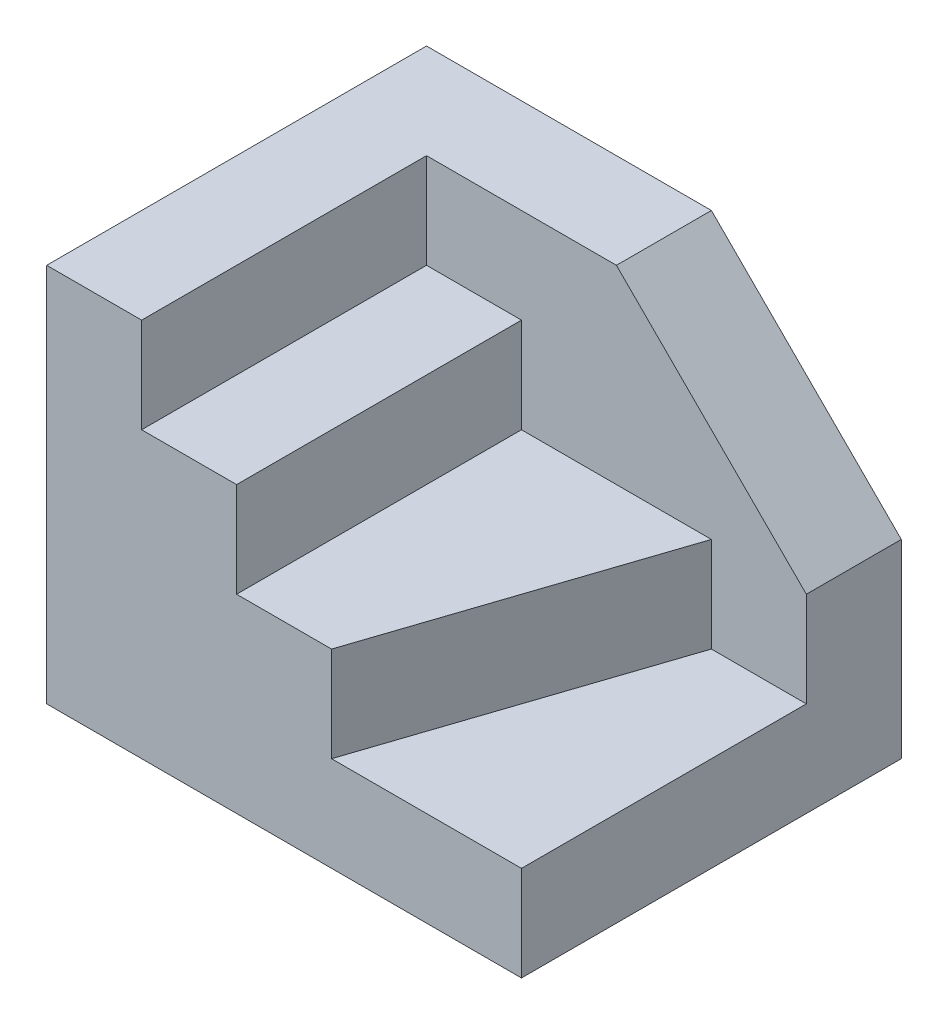
ISO-10303-21;
HEADER;
FILE_DESCRIPTION(('STEP AP214'),'2;1');
FILE_NAME('part.step','',(''),(''),'','','');
FILE_SCHEMA(('AUTOMOTIVE_DESIGN { 1 0 10303 214 1 1 1 1 }'));
ENDSEC;
DATA;
#1=APPLICATION_CONTEXT('core data for automotive mechanical design processes');
#2=APPLICATION_PROTOCOL_DEFINITION('international standard','automotive_design',2000,#1);
#3=PRODUCT_CONTEXT('',#1,'mechanical');
#4=PRODUCT('Part','Part','',(#3));
#5=PRODUCT_RELATED_PRODUCT_CATEGORY('part','',(#4));
#6=PRODUCT_DEFINITION_FORMATION('','',#4);
#7=PRODUCT_DEFINITION_CONTEXT('part definition',#1,'design');
#8=PRODUCT_DEFINITION('design','',#6,#7);
#9=PRODUCT_DEFINITION_SHAPE('','',#8);
#10=(LENGTH_UNIT() NAMED_UNIT(*) SI_UNIT(.MILLI.,.METRE.));
#11=(NAMED_UNIT(*) PLANE_ANGLE_UNIT() SI_UNIT($,.RADIAN.));
#12=(NAMED_UNIT(*) SI_UNIT($,.STERADIAN.) SOLID_ANGLE_UNIT());
#13=UNCERTAINTY_MEASURE_WITH_UNIT(LENGTH_MEASURE(1.E-05),#10,'distance_accuracy_value','');
#14=(GEOMETRIC_REPRESENTATION_CONTEXT(3) GLOBAL_UNCERTAINTY_ASSIGNED_CONTEXT((#13)) GLOBAL_UNIT_ASSIGNED_CONTEXT((#10,
#11,#12)) REPRESENTATION_CONTEXT('',''));
#15=CARTESIAN_POINT('',(0.,0.,0.));
#16=DIRECTION('',(0.,0.,1.));
#17=DIRECTION('',(1.,0.,0.));
#18=AXIS2_PLACEMENT_3D('',#15,#16,#17);
#19=CARTESIAN_POINT('',(-10.,26.4814814814815,30.));
#20=DIRECTION('',(0.,-1.,0.));
#21=DIRECTION('',(0.,0.,-1.));
#22=AXIS2_PLACEMENT_3D('',#19,#20,#21);
#23=PLANE('',#22);
#24=DIRECTION('',(0.,0.,-1.));
#25=VECTOR('',#24,1.);
#26=CARTESIAN_POINT('',(-10.,26.4814814814815,30.));
#27=LINE('',#26,#25);
#28=CARTESIAN_POINT('',(-10.,26.4814814814815,30.));
#29=VERTEX_POINT('',#28);
#30=CARTESIAN_POINT('',(-10.,26.4814814814815,0.));
#31=VERTEX_POINT('',#30);
#32=EDGE_CURVE('E196',#29,#31,#27,.T.);
#33=ORIENTED_EDGE('',*,*,#32,.T.);
#34=DIRECTION('',(1.,0.,0.));
#35=VECTOR('',#34,1.);
#36=CARTESIAN_POINT('',(-20.,26.4814814814815,0.));
#37=LINE('',#36,#35);
#38=CARTESIAN_POINT('',(10.,26.4814814814815,0.));
#39=VERTEX_POINT('',#38);
#40=EDGE_CURVE('E149',#31,#39,#37,.T.);
#41=ORIENTED_EDGE('',*,*,#40,.T.);
#42=DIRECTION('',(0.,0.,1.));
#43=VECTOR('',#42,1.);
#44=CARTESIAN_POINT('',(10.,26.4814814814815,-10.));
#45=LINE('',#44,#43);
#46=CARTESIAN_POINT('',(10.,26.4814814814815,-10.));
#47=VERTEX_POINT('',#46);
#48=EDGE_CURVE('E127',#47,#39,#45,.T.);
#49=ORIENTED_EDGE('',*,*,#48,.F.);
#50=DIRECTION('',(1.,0.,0.));
#51=VECTOR('',#50,1.);
#52=CARTESIAN_POINT('',(-20.,26.4814814814815,-10.));
#53=LINE('',#52,#51);
#54=CARTESIAN_POINT('',(-20.,26.4814814814815,-10.));
#55=VERTEX_POINT('',#54);
#56=EDGE_CURVE('E135',#55,#47,#53,.T.);
#57=ORIENTED_EDGE('',*,*,#56,.F.);
#58=DIRECTION('',(0.,0.,-1.));
#59=VECTOR('',#58,1.);
#60=CARTESIAN_POINT('',(-20.,26.4814814814815,30.));
#61=LINE('',#60,#59);
#62=CARTESIAN_POINT('',(-20.,26.4814814814815,30.));
#63=VERTEX_POINT('',#62);
#64=EDGE_CURVE('E11',#63,#55,#61,.T.);
#65=ORIENTED_EDGE('',*,*,#64,.F.);
#66=DIRECTION('',(-1.,0.,0.));
#67=VECTOR('',#66,1.);
#68=CARTESIAN_POINT('',(-10.,26.4814814814815,30.));
#69=LINE('',#68,#67);
#70=EDGE_CURVE('E169',#29,#63,#69,.T.);
#71=ORIENTED_EDGE('',*,*,#70,.F.);
#72=EDGE_LOOP('',(#33,#41,#49,#57,#65,#71));
#73=FACE_BOUND('',#72,.T.);
#74=ADVANCED_FACE('F39',(#73),#23,.F.);
#75=CARTESIAN_POINT('',(-20.,26.4814814814815,30.));
#76=DIRECTION('',(1.,0.,0.));
#77=DIRECTION('',(0.,1.,0.));
#78=AXIS2_PLACEMENT_3D('',#75,#76,#77);
#79=PLANE('',#78);
#80=ORIENTED_EDGE('',*,*,#64,.T.);
#81=DIRECTION('',(0.,1.,0.));
#82=VECTOR('',#81,1.);
#83=CARTESIAN_POINT('',(-20.,26.4814814814815,-10.));
#84=LINE('',#83,#82);
#85=CARTESIAN_POINT('',(-20.,-13.5185185185185,-10.));
#86=VERTEX_POINT('',#85);
#87=EDGE_CURVE('E142',#86,#55,#84,.T.);
#88=ORIENTED_EDGE('',*,*,#87,.F.);
#89=DIRECTION('',(0.,0.,-1.));
#90=VECTOR('',#89,1.);
#91=CARTESIAN_POINT('',(-20.,-13.5185185185185,30.));
#92=LINE('',#91,#90);
#93=CARTESIAN_POINT('',(-20.,-13.5185185185185,30.));
#94=VERTEX_POINT('',#93);
#95=EDGE_CURVE('E48',#94,#86,#92,.T.);
#96=ORIENTED_EDGE('',*,*,#95,.F.);
#97=DIRECTION('',(0.,-1.,0.));
#98=VECTOR('',#97,1.);
#99=CARTESIAN_POINT('',(-20.,26.4814814814815,30.));
#100=LINE('',#99,#98);
#101=EDGE_CURVE('E172',#63,#94,#100,.T.);
#102=ORIENTED_EDGE('',*,*,#101,.F.);
#103=EDGE_LOOP('',(#80,#88,#96,#102));
#104=FACE_BOUND('',#103,.T.);
#105=ADVANCED_FACE('F250',(#104),#79,.F.);
#106=CARTESIAN_POINT('',(-20.,-13.5185185185185,30.));
#107=DIRECTION('',(0.,1.,0.));
#108=DIRECTION('',(-1.,0.,0.));
#109=AXIS2_PLACEMENT_3D('',#106,#107,#108);
#110=PLANE('',#109);
#111=ORIENTED_EDGE('',*,*,#95,.T.);
#112=DIRECTION('',(-1.,0.,0.));
#113=VECTOR('',#112,1.);
#114=CARTESIAN_POINT('',(-20.,-13.5185185185185,-10.));
#115=LINE('',#114,#113);
#116=CARTESIAN_POINT('',(30.,-13.5185185185185,-10.));
#117=VERTEX_POINT('',#116);
#118=EDGE_CURVE('E246',#117,#86,#115,.T.);
#119=ORIENTED_EDGE('',*,*,#118,.F.);
#120=DIRECTION('',(0.,0.,-1.));
#121=VECTOR('',#120,1.);
#122=CARTESIAN_POINT('',(30.,-13.5185185185185,30.));
#123=LINE('',#122,#121);
#124=CARTESIAN_POINT('',(30.,-13.5185185185185,30.));
#125=VERTEX_POINT('',#124);
#126=EDGE_CURVE('E237',#125,#117,#123,.T.);
#127=ORIENTED_EDGE('',*,*,#126,.F.);
#128=DIRECTION('',(1.,0.,0.));
#129=VECTOR('',#128,1.);
#130=CARTESIAN_POINT('',(-20.,-13.5185185185185,30.));
#131=LINE('',#130,#129);
#132=EDGE_CURVE('E176',#94,#125,#131,.T.);
#133=ORIENTED_EDGE('',*,*,#132,.F.);
#134=EDGE_LOOP('',(#111,#119,#127,#133));
#135=FACE_BOUND('',#134,.T.);
#136=ADVANCED_FACE('F244',(#135),#110,.F.);
#137=CARTESIAN_POINT('',(30.,-13.5185185185185,30.));
#138=DIRECTION('',(-1.,0.,0.));
#139=DIRECTION('',(0.,-1.,0.));
#140=AXIS2_PLACEMENT_3D('',#137,#138,#139);
#141=PLANE('',#140);
#142=ORIENTED_EDGE('',*,*,#126,.T.);
#143=DIRECTION('',(0.,-1.,0.));
#144=VECTOR('',#143,1.);
#145=CARTESIAN_POINT('',(30.,-13.5185185185185,-10.));
#146=LINE('',#145,#144);
#147=CARTESIAN_POINT('',(30.,6.48148148148147,-10.));
#148=VERTEX_POINT('',#147);
#149=EDGE_CURVE('E134',#148,#117,#146,.T.);
#150=ORIENTED_EDGE('',*,*,#149,.F.);
#151=DIRECTION('',(0.,0.,1.));
#152=VECTOR('',#151,1.);
#153=CARTESIAN_POINT('',(30.,6.48148148148147,-10.));
#154=LINE('',#153,#152);
#155=CARTESIAN_POINT('',(30.,6.48148148148147,0.));
#156=VERTEX_POINT('',#155);
#157=EDGE_CURVE('E129',#148,#156,#154,.T.);
#158=ORIENTED_EDGE('',*,*,#157,.T.);
#159=DIRECTION('',(0.,-1.,0.));
#160=VECTOR('',#159,1.);
#161=CARTESIAN_POINT('',(30.,-13.5185185185185,0.));
#162=LINE('',#161,#160);
#163=CARTESIAN_POINT('',(30.,-3.51851851851852,0.));
#164=VERTEX_POINT('',#163);
#165=EDGE_CURVE('E146',#156,#164,#162,.T.);
#166=ORIENTED_EDGE('',*,*,#165,.T.);
#167=DIRECTION('',(0.,0.,-1.));
#168=VECTOR('',#167,1.);
#169=CARTESIAN_POINT('',(30.,-3.51851851851852,30.));
#170=LINE('',#169,#168);
#171=CARTESIAN_POINT('',(30.,-3.51851851851852,30.));
#172=VERTEX_POINT('',#171);
#173=EDGE_CURVE('E233',#172,#164,#170,.T.);
#174=ORIENTED_EDGE('',*,*,#173,.F.);
#175=DIRECTION('',(0.,1.,0.));
#176=VECTOR('',#175,1.);
#177=CARTESIAN_POINT('',(30.,-13.5185185185185,30.));
#178=LINE('',#177,#176);
#179=EDGE_CURVE('E179',#125,#172,#178,.T.);
#180=ORIENTED_EDGE('',*,*,#179,.F.);
#181=EDGE_LOOP('',(#142,#150,#158,#166,#174,#180));
#182=FACE_BOUND('',#181,.T.);
#183=ADVANCED_FACE('F264',(#182),#141,.F.);
#184=CARTESIAN_POINT('',(30.,-3.51851851851852,30.));
#185=DIRECTION('',(0.,-1.,0.));
#186=DIRECTION('',(1.,0.,0.));
#187=AXIS2_PLACEMENT_3D('',#184,#185,#186);
#188=PLANE('',#187);
#189=DIRECTION('',(-1.,0.,0.));
#190=VECTOR('',#189,1.);
#191=CARTESIAN_POINT('',(30.,-3.51851851851852,0.));
#192=LINE('',#191,#190);
#193=CARTESIAN_POINT('',(20.,-3.51851851851853,0.));
#194=VERTEX_POINT('',#193);
#195=EDGE_CURVE('E168',#164,#194,#192,.T.);
#196=ORIENTED_EDGE('',*,*,#195,.T.);
#197=DIRECTION('',(-0.316227766016838,0.,0.948683298050514));
#198=VECTOR('',#197,1.);
#199=CARTESIAN_POINT('',(20.,-3.51851851851853,0.));
#200=LINE('',#199,#198);
#201=CARTESIAN_POINT('',(10.,-3.51851851851853,30.));
#202=VERTEX_POINT('',#201);
#203=EDGE_CURVE('E156',#194,#202,#200,.T.);
#204=ORIENTED_EDGE('',*,*,#203,.T.);
#205=DIRECTION('',(-1.,0.,0.));
#206=VECTOR('',#205,1.);
#207=CARTESIAN_POINT('',(30.,-3.51851851851852,30.));
#208=LINE('',#207,#206);
#209=EDGE_CURVE('E182',#172,#202,#208,.T.);
#210=ORIENTED_EDGE('',*,*,#209,.F.);
#211=ORIENTED_EDGE('',*,*,#173,.T.);
#212=EDGE_LOOP('',(#196,#204,#210,#211));
#213=FACE_BOUND('',#212,.T.);
#214=ADVANCED_FACE('F269',(#213),#188,.F.);
#215=CARTESIAN_POINT('',(20.,6.48148148148147,30.));
#216=DIRECTION('',(0.,-1.,0.));
#217=DIRECTION('',(1.,0.,0.));
#218=AXIS2_PLACEMENT_3D('',#215,#216,#217);
#219=PLANE('',#218);
#220=DIRECTION('',(-1.,0.,0.));
#221=VECTOR('',#220,1.);
#222=CARTESIAN_POINT('',(20.,6.48148148148147,30.));
#223=LINE('',#222,#221);
#224=CARTESIAN_POINT('',(10.,6.48148148148147,30.));
#225=VERTEX_POINT('',#224);
#226=CARTESIAN_POINT('',(0.,6.48148148148147,30.));
#227=VERTEX_POINT('',#226);
#228=EDGE_CURVE('E185',#225,#227,#223,.T.);
#229=ORIENTED_EDGE('',*,*,#228,.F.);
#230=DIRECTION('',(-0.316227766016838,0.,0.948683298050514));
#231=VECTOR('',#230,1.);
#232=CARTESIAN_POINT('',(20.,6.48148148148147,0.));
#233=LINE('',#232,#231);
#234=CARTESIAN_POINT('',(20.,6.48148148148147,0.));
#235=VERTEX_POINT('',#234);
#236=EDGE_CURVE('E152',#235,#225,#233,.T.);
#237=ORIENTED_EDGE('',*,*,#236,.F.);
#238=DIRECTION('',(-1.,0.,0.));
#239=VECTOR('',#238,1.);
#240=CARTESIAN_POINT('',(20.,6.48148148148147,0.));
#241=LINE('',#240,#239);
#242=CARTESIAN_POINT('',(0.,6.48148148148147,0.));
#243=VERTEX_POINT('',#242);
#244=EDGE_CURVE('E204',#235,#243,#241,.T.);
#245=ORIENTED_EDGE('',*,*,#244,.T.);
#246=DIRECTION('',(0.,0.,-1.));
#247=VECTOR('',#246,1.);
#248=CARTESIAN_POINT('',(0.,6.48148148148147,30.));
#249=LINE('',#248,#247);
#250=EDGE_CURVE('E229',#227,#243,#249,.T.);
#251=ORIENTED_EDGE('',*,*,#250,.F.);
#252=EDGE_LOOP('',(#229,#237,#245,#251));
#253=FACE_BOUND('',#252,.T.);
#254=ADVANCED_FACE('F279',(#253),#219,.F.);
#255=CARTESIAN_POINT('',(0.,6.48148148148147,30.));
#256=DIRECTION('',(-1.,0.,0.));
#257=DIRECTION('',(0.,-1.,0.));
#258=AXIS2_PLACEMENT_3D('',#255,#256,#257);
#259=PLANE('',#258);
#260=DIRECTION('',(0.,1.,0.));
#261=VECTOR('',#260,1.);
#262=CARTESIAN_POINT('',(0.,6.48148148148147,0.));
#263=LINE('',#262,#261);
#264=CARTESIAN_POINT('',(0.,16.4814814814815,0.));
#265=VERTEX_POINT('',#264);
#266=EDGE_CURVE('E208',#243,#265,#263,.T.);
#267=ORIENTED_EDGE('',*,*,#266,.T.);
#268=DIRECTION('',(0.,0.,-1.));
#269=VECTOR('',#268,1.);
#270=CARTESIAN_POINT('',(0.,16.4814814814815,30.));
#271=LINE('',#270,#269);
#272=CARTESIAN_POINT('',(0.,16.4814814814815,30.));
#273=VERTEX_POINT('',#272);
#274=EDGE_CURVE('E225',#273,#265,#271,.T.);
#275=ORIENTED_EDGE('',*,*,#274,.F.);
#276=DIRECTION('',(0.,1.,0.));
#277=VECTOR('',#276,1.);
#278=CARTESIAN_POINT('',(0.,6.48148148148147,30.));
#279=LINE('',#278,#277);
#280=EDGE_CURVE('E188',#227,#273,#279,.T.);
#281=ORIENTED_EDGE('',*,*,#280,.F.);
#282=ORIENTED_EDGE('',*,*,#250,.T.);
#283=EDGE_LOOP('',(#267,#275,#281,#282));
#284=FACE_BOUND('',#283,.T.);
#285=ADVANCED_FACE('F286',(#284),#259,.F.);
#286=CARTESIAN_POINT('',(0.,16.4814814814815,30.));
#287=DIRECTION('',(0.,-1.,0.));
#288=DIRECTION('',(1.,0.,0.));
#289=AXIS2_PLACEMENT_3D('',#286,#287,#288);
#290=PLANE('',#289);
#291=DIRECTION('',(-1.,0.,0.));
#292=VECTOR('',#291,1.);
#293=CARTESIAN_POINT('',(0.,16.4814814814815,0.));
#294=LINE('',#293,#292);
#295=CARTESIAN_POINT('',(-10.,16.4814814814815,0.));
#296=VERTEX_POINT('',#295);
#297=EDGE_CURVE('E212',#265,#296,#294,.T.);
#298=ORIENTED_EDGE('',*,*,#297,.T.);
#299=DIRECTION('',(0.,0.,-1.));
#300=VECTOR('',#299,1.);
#301=CARTESIAN_POINT('',(-10.,16.4814814814815,30.));
#302=LINE('',#301,#300);
#303=CARTESIAN_POINT('',(-10.,16.4814814814815,30.));
#304=VERTEX_POINT('',#303);
#305=EDGE_CURVE('E221',#304,#296,#302,.T.);
#306=ORIENTED_EDGE('',*,*,#305,.F.);
#307=DIRECTION('',(-1.,0.,0.));
#308=VECTOR('',#307,1.);
#309=CARTESIAN_POINT('',(0.,16.4814814814815,30.));
#310=LINE('',#309,#308);
#311=EDGE_CURVE('E191',#273,#304,#310,.T.);
#312=ORIENTED_EDGE('',*,*,#311,.F.);
#313=ORIENTED_EDGE('',*,*,#274,.T.);
#314=EDGE_LOOP('',(#298,#306,#312,#313));
#315=FACE_BOUND('',#314,.T.);
#316=ADVANCED_FACE('F288',(#315),#290,.F.);
#317=CARTESIAN_POINT('',(-10.,16.4814814814815,30.));
#318=DIRECTION('',(-1.,0.,0.));
#319=DIRECTION('',(0.,-1.,0.));
#320=AXIS2_PLACEMENT_3D('',#317,#318,#319);
#321=PLANE('',#320);
#322=DIRECTION('',(0.,1.,0.));
#323=VECTOR('',#322,1.);
#324=CARTESIAN_POINT('',(-10.,16.4814814814815,0.));
#325=LINE('',#324,#323);
#326=EDGE_CURVE('E173',#296,#31,#325,.T.);
#327=ORIENTED_EDGE('',*,*,#326,.T.);
#328=ORIENTED_EDGE('',*,*,#32,.F.);
#329=DIRECTION('',(0.,1.,0.));
#330=VECTOR('',#329,1.);
#331=CARTESIAN_POINT('',(-10.,16.4814814814815,30.));
#332=LINE('',#331,#330);
#333=EDGE_CURVE('E55',#304,#29,#332,.T.);
#334=ORIENTED_EDGE('',*,*,#333,.F.);
#335=ORIENTED_EDGE('',*,*,#305,.T.);
#336=EDGE_LOOP('',(#327,#328,#334,#335));
#337=FACE_BOUND('',#336,.T.);
#338=ADVANCED_FACE('F290',(#337),#321,.F.);
#339=CARTESIAN_POINT('',(0.,0.,30.));
#340=DIRECTION('',(0.,0.,1.));
#341=DIRECTION('',(1.,0.,0.));
#342=AXIS2_PLACEMENT_3D('',#339,#340,#341);
#343=PLANE('',#342);
#344=DIRECTION('',(0.,1.,0.));
#345=VECTOR('',#344,1.);
#346=CARTESIAN_POINT('',(10.,-3.51851851851853,30.));
#347=LINE('',#346,#345);
#348=EDGE_CURVE('E163',#202,#225,#347,.T.);
#349=ORIENTED_EDGE('',*,*,#348,.T.);
#350=ORIENTED_EDGE('',*,*,#228,.T.);
#351=ORIENTED_EDGE('',*,*,#280,.T.);
#352=ORIENTED_EDGE('',*,*,#311,.T.);
#353=ORIENTED_EDGE('',*,*,#333,.T.);
#354=ORIENTED_EDGE('',*,*,#70,.T.);
#355=ORIENTED_EDGE('',*,*,#101,.T.);
#356=ORIENTED_EDGE('',*,*,#132,.T.);
#357=ORIENTED_EDGE('',*,*,#179,.T.);
#358=ORIENTED_EDGE('',*,*,#209,.T.);
#359=EDGE_LOOP('',(#349,#350,#351,#352,#353,#354,#355,#356,#357,#358));
#360=FACE_BOUND('',#359,.T.);
#361=ADVANCED_FACE('F272',(#360),#343,.T.);
#362=CARTESIAN_POINT('',(20.,-3.51851851851853,0.));
#363=DIRECTION('',(-0.948683298050514,0.,-0.316227766016838));
#364=DIRECTION('',(-0.316227766016838,0.,0.948683298050514));
#365=AXIS2_PLACEMENT_3D('',#362,#363,#364);
#366=PLANE('',#365);
#367=ORIENTED_EDGE('',*,*,#236,.T.);
#368=ORIENTED_EDGE('',*,*,#348,.F.);
#369=ORIENTED_EDGE('',*,*,#203,.F.);
#370=DIRECTION('',(0.,1.,0.));
#371=VECTOR('',#370,1.);
#372=CARTESIAN_POINT('',(20.,-3.51851851851853,0.));
#373=LINE('',#372,#371);
#374=EDGE_CURVE('E200',#194,#235,#373,.T.);
#375=ORIENTED_EDGE('',*,*,#374,.T.);
#376=EDGE_LOOP('',(#367,#368,#369,#375));
#377=FACE_BOUND('',#376,.T.);
#378=ADVANCED_FACE('F275',(#377),#366,.F.);
#379=CARTESIAN_POINT('',(0.,0.,0.));
#380=DIRECTION('',(0.,0.,1.));
#381=DIRECTION('',(1.,0.,0.));
#382=AXIS2_PLACEMENT_3D('',#379,#380,#381);
#383=PLANE('',#382);
#384=ORIENTED_EDGE('',*,*,#326,.F.);
#385=ORIENTED_EDGE('',*,*,#297,.F.);
#386=ORIENTED_EDGE('',*,*,#266,.F.);
#387=ORIENTED_EDGE('',*,*,#244,.F.);
#388=ORIENTED_EDGE('',*,*,#374,.F.);
#389=ORIENTED_EDGE('',*,*,#195,.F.);
#390=ORIENTED_EDGE('',*,*,#165,.F.);
#391=DIRECTION('',(0.707106781186547,-0.707106781186548,0.));
#392=VECTOR('',#391,1.);
#393=CARTESIAN_POINT('',(10.,26.4814814814815,0.));
#394=LINE('',#393,#392);
#395=EDGE_CURVE('E257',#39,#156,#394,.T.);
#396=ORIENTED_EDGE('',*,*,#395,.F.);
#397=ORIENTED_EDGE('',*,*,#40,.F.);
#398=EDGE_LOOP('',(#384,#385,#386,#387,#388,#389,#390,#396,#397));
#399=FACE_BOUND('',#398,.T.);
#400=ADVANCED_FACE('F293',(#399),#383,.T.);
#401=CARTESIAN_POINT('',(10.,26.4814814814815,-10.));
#402=DIRECTION('',(-0.707106781186548,-0.707106781186547,0.));
#403=DIRECTION('',(0.707106781186547,-0.707106781186548,0.));
#404=AXIS2_PLACEMENT_3D('',#401,#402,#403);
#405=PLANE('',#404);
#406=ORIENTED_EDGE('',*,*,#395,.T.);
#407=ORIENTED_EDGE('',*,*,#157,.F.);
#408=DIRECTION('',(0.707106781186547,-0.707106781186548,0.));
#409=VECTOR('',#408,1.);
#410=CARTESIAN_POINT('',(10.,26.4814814814815,-10.));
#411=LINE('',#410,#409);
#412=EDGE_CURVE('E123',#47,#148,#411,.T.);
#413=ORIENTED_EDGE('',*,*,#412,.F.);
#414=ORIENTED_EDGE('',*,*,#48,.T.);
#415=EDGE_LOOP('',(#406,#407,#413,#414));
#416=FACE_BOUND('',#415,.T.);
#417=ADVANCED_FACE('F125',(#416),#405,.F.);
#418=CARTESIAN_POINT('',(0.,0.,-10.));
#419=DIRECTION('',(0.,0.,1.));
#420=DIRECTION('',(1.,0.,0.));
#421=AXIS2_PLACEMENT_3D('',#418,#419,#420);
#422=PLANE('',#421);
#423=ORIENTED_EDGE('',*,*,#56,.T.);
#424=ORIENTED_EDGE('',*,*,#412,.T.);
#425=ORIENTED_EDGE('',*,*,#149,.T.);
#426=ORIENTED_EDGE('',*,*,#118,.T.);
#427=ORIENTED_EDGE('',*,*,#87,.T.);
#428=EDGE_LOOP('',(#423,#424,#425,#426,#427));
#429=FACE_BOUND('',#428,.T.);
#430=ADVANCED_FACE('F139',(#429),#422,.F.);
#431=CLOSED_SHELL('',(#74,#105,#136,#183,#214,#254,#285,#316,#338,#361,#378,#400,#417,#430));
#432=MANIFOLD_SOLID_BREP('B2',#431);
#433=ADVANCED_BREP_SHAPE_REPRESENTATION('',(#18,#432),#14);
#434=SHAPE_DEFINITION_REPRESENTATION(#9,#433);
ENDSEC;
END-ISO-10303-21;
